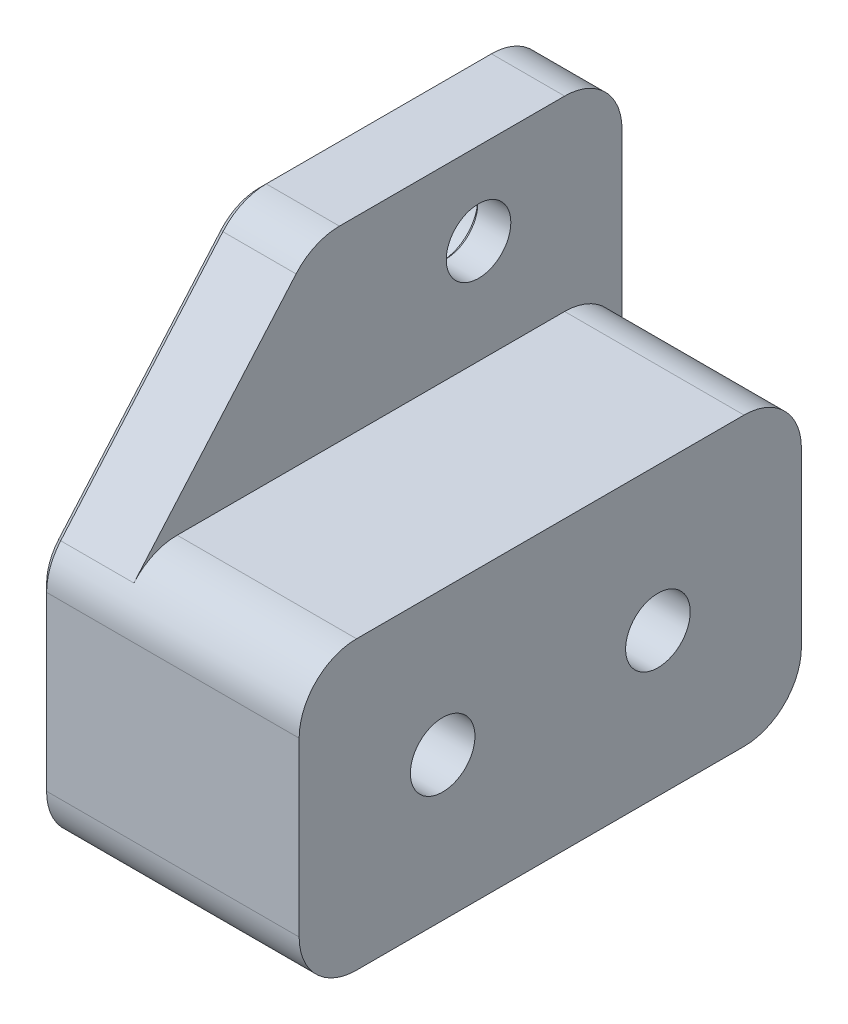
ISO-10303-21;
HEADER;
FILE_DESCRIPTION(('STEP AP214'),'2;1');
FILE_NAME('part.step','',(''),(''),'','','');
FILE_SCHEMA(('AUTOMOTIVE_DESIGN { 1 0 10303 214 1 1 1 1 }'));
ENDSEC;
DATA;
#1=APPLICATION_CONTEXT('core data for automotive mechanical design processes');
#2=APPLICATION_PROTOCOL_DEFINITION('international standard','automotive_design',2000,#1);
#3=PRODUCT_CONTEXT('',#1,'mechanical');
#4=PRODUCT('Part','Part','',(#3));
#5=PRODUCT_RELATED_PRODUCT_CATEGORY('part','',(#4));
#6=PRODUCT_DEFINITION_FORMATION('','',#4);
#7=PRODUCT_DEFINITION_CONTEXT('part definition',#1,'design');
#8=PRODUCT_DEFINITION('design','',#6,#7);
#9=PRODUCT_DEFINITION_SHAPE('','',#8);
#10=(LENGTH_UNIT() NAMED_UNIT(*) SI_UNIT(.MILLI.,.METRE.));
#11=(NAMED_UNIT(*) PLANE_ANGLE_UNIT() SI_UNIT($,.RADIAN.));
#12=(NAMED_UNIT(*) SI_UNIT($,.STERADIAN.) SOLID_ANGLE_UNIT());
#13=UNCERTAINTY_MEASURE_WITH_UNIT(LENGTH_MEASURE(1.E-05),#10,'distance_accuracy_value','');
#14=(GEOMETRIC_REPRESENTATION_CONTEXT(3) GLOBAL_UNCERTAINTY_ASSIGNED_CONTEXT((#13)) GLOBAL_UNIT_ASSIGNED_CONTEXT((#10,
#11,#12)) REPRESENTATION_CONTEXT('',''));
#15=CARTESIAN_POINT('',(0.,0.,0.));
#16=DIRECTION('',(0.,0.,1.));
#17=DIRECTION('',(1.,0.,0.));
#18=AXIS2_PLACEMENT_3D('',#15,#16,#17);
#19=CARTESIAN_POINT('',(0.,-6.,21.));
#20=DIRECTION('',(1.,0.,0.));
#21=DIRECTION('',(0.,0.,-1.));
#22=AXIS2_PLACEMENT_3D('',#19,#20,#21);
#23=PLANE('',#22);
#24=CARTESIAN_POINT('',(0.,17.25,0.));
#25=DIRECTION('',(1.,0.,0.));
#26=DIRECTION('',(0.,0.,-1.));
#27=AXIS2_PLACEMENT_3D('',#24,#25,#26);
#28=CIRCLE('',#27,3.45);
#29=CARTESIAN_POINT('',(0.,17.25,-3.45));
#30=VERTEX_POINT('',#29);
#31=EDGE_CURVE('E276',#30,#30,#28,.F.);
#32=ORIENTED_EDGE('',*,*,#31,.T.);
#33=EDGE_LOOP('',(#32));
#34=FACE_BOUND('',#33,.T.);
#35=CARTESIAN_POINT('',(0.,17.25,0.));
#36=DIRECTION('',(1.,0.,0.));
#37=DIRECTION('',(0.,0.,-1.));
#38=AXIS2_PLACEMENT_3D('',#35,#36,#37);
#39=CIRCLE('',#38,2.55);
#40=CARTESIAN_POINT('',(0.,17.25,-2.55));
#41=VERTEX_POINT('',#40);
#42=EDGE_CURVE('E273',#41,#41,#39,.T.);
#43=ORIENTED_EDGE('',*,*,#42,.T.);
#44=EDGE_LOOP('',(#43));
#45=FACE_BOUND('',#44,.T.);
#46=ADVANCED_FACE('F39',(#34,#45),#23,.F.);
#47=CARTESIAN_POINT('',(0.,0.,0.));
#48=DIRECTION('',(1.,0.,0.));
#49=DIRECTION('',(0.,0.,-1.));
#50=AXIS2_PLACEMENT_3D('',#47,#48,#49);
#51=CIRCLE('',#50,3.45);
#52=CARTESIAN_POINT('',(0.,0.,-3.45));
#53=VERTEX_POINT('',#52);
#54=EDGE_CURVE('E306',#53,#53,#51,.F.);
#55=ORIENTED_EDGE('',*,*,#54,.T.);
#56=EDGE_LOOP('',(#55));
#57=FACE_BOUND('',#56,.T.);
#58=CARTESIAN_POINT('',(0.,0.,0.));
#59=DIRECTION('',(1.,0.,0.));
#60=DIRECTION('',(0.,0.,-1.));
#61=AXIS2_PLACEMENT_3D('',#58,#59,#60);
#62=CIRCLE('',#61,2.55);
#63=CARTESIAN_POINT('',(0.,0.,-2.55));
#64=VERTEX_POINT('',#63);
#65=EDGE_CURVE('E302',#64,#64,#62,.T.);
#66=ORIENTED_EDGE('',*,*,#65,.T.);
#67=EDGE_LOOP('',(#66));
#68=FACE_BOUND('',#67,.T.);
#69=ADVANCED_FACE('F502',(#57,#68),#23,.F.);
#70=CARTESIAN_POINT('',(0.,0.,15.));
#71=DIRECTION('',(1.,0.,0.));
#72=DIRECTION('',(0.,0.,-1.));
#73=AXIS2_PLACEMENT_3D('',#70,#71,#72);
#74=CIRCLE('',#73,3.45);
#75=CARTESIAN_POINT('',(0.,0.,11.55));
#76=VERTEX_POINT('',#75);
#77=EDGE_CURVE('E290',#76,#76,#74,.F.);
#78=ORIENTED_EDGE('',*,*,#77,.T.);
#79=EDGE_LOOP('',(#78));
#80=FACE_BOUND('',#79,.T.);
#81=CARTESIAN_POINT('',(0.,0.,15.));
#82=DIRECTION('',(1.,0.,0.));
#83=DIRECTION('',(0.,0.,-1.));
#84=AXIS2_PLACEMENT_3D('',#81,#82,#83);
#85=CIRCLE('',#84,2.55);
#86=CARTESIAN_POINT('',(0.,0.,12.45));
#87=VERTEX_POINT('',#86);
#88=EDGE_CURVE('E286',#87,#87,#85,.T.);
#89=ORIENTED_EDGE('',*,*,#88,.T.);
#90=EDGE_LOOP('',(#89));
#91=FACE_BOUND('',#90,.T.);
#92=ADVANCED_FACE('F505',(#80,#91),#23,.F.);
#93=CARTESIAN_POINT('',(2.6,-6.,21.));
#94=DIRECTION('',(1.,0.,0.));
#95=DIRECTION('',(0.,0.,-1.));
#96=AXIS2_PLACEMENT_3D('',#93,#94,#95);
#97=PLANE('',#96);
#98=CARTESIAN_POINT('',(2.6,5.99999999999999,21.));
#99=DIRECTION('',(1.,0.,0.));
#100=DIRECTION('',(0.,0.,1.));
#101=AXIS2_PLACEMENT_3D('',#98,#99,#100);
#102=CIRCLE('',#101,4.);
#103=CARTESIAN_POINT('',(2.6,9.99999999999999,21.));
#104=VERTEX_POINT('',#103);
#105=CARTESIAN_POINT('',(2.6,8.62471485969914,24.018422088654));
#106=VERTEX_POINT('',#105);
#107=EDGE_CURVE('E57',#104,#106,#102,.T.);
#108=ORIENTED_EDGE('',*,*,#107,.F.);
#109=DIRECTION('',(0.,0.,1.));
#110=VECTOR('',#109,1.);
#111=CARTESIAN_POINT('',(2.6,9.99999999999999,21.));
#112=LINE('',#111,#110);
#113=CARTESIAN_POINT('',(2.6,9.99999999999999,-6.));
#114=VERTEX_POINT('',#113);
#115=EDGE_CURVE('E201',#114,#104,#112,.T.);
#116=ORIENTED_EDGE('',*,*,#115,.F.);
#117=CARTESIAN_POINT('',(2.6,6.,-6.));
#118=DIRECTION('',(1.,0.,0.));
#119=DIRECTION('',(0.,0.,-1.));
#120=AXIS2_PLACEMENT_3D('',#117,#118,#119);
#121=CIRCLE('',#120,3.99999999999999);
#122=CARTESIAN_POINT('',(2.6,6.,-10.));
#123=VERTEX_POINT('',#122);
#124=EDGE_CURVE('E63',#123,#114,#121,.T.);
#125=ORIENTED_EDGE('',*,*,#124,.F.);
#126=DIRECTION('',(0.,1.,0.));
#127=VECTOR('',#126,1.);
#128=CARTESIAN_POINT('',(2.6,-6.,-10.));
#129=LINE('',#128,#127);
#130=CARTESIAN_POINT('',(2.6,19.,-10.));
#131=VERTEX_POINT('',#130);
#132=EDGE_CURVE('E233',#123,#131,#129,.T.);
#133=ORIENTED_EDGE('',*,*,#132,.T.);
#134=CARTESIAN_POINT('',(2.6,19.,-6.));
#135=DIRECTION('',(1.,0.,0.));
#136=DIRECTION('',(0.,0.,-1.));
#137=AXIS2_PLACEMENT_3D('',#134,#135,#136);
#138=CIRCLE('',#137,4.);
#139=CARTESIAN_POINT('',(2.6,23.,-6.));
#140=VERTEX_POINT('',#139);
#141=EDGE_CURVE('E235',#131,#140,#138,.T.);
#142=ORIENTED_EDGE('',*,*,#141,.T.);
#143=DIRECTION('',(0.,0.,1.));
#144=VECTOR('',#143,1.);
#145=CARTESIAN_POINT('',(2.6,23.,-6.));
#146=LINE('',#145,#144);
#147=CARTESIAN_POINT('',(2.6,23.,9.69565217391305));
#148=VERTEX_POINT('',#147);
#149=EDGE_CURVE('E237',#140,#148,#146,.T.);
#150=ORIENTED_EDGE('',*,*,#149,.T.);
#151=CARTESIAN_POINT('',(2.6,19.,9.69565217391305));
#152=DIRECTION('',(1.,0.,0.));
#153=DIRECTION('',(0.,0.,-1.));
#154=AXIS2_PLACEMENT_3D('',#151,#152,#153);
#155=CIRCLE('',#154,4.);
#156=CARTESIAN_POINT('',(2.6,21.6247148596991,12.7140742625671));
#157=VERTEX_POINT('',#156);
#158=EDGE_CURVE('E239',#148,#157,#155,.T.);
#159=ORIENTED_EDGE('',*,*,#158,.T.);
#160=DIRECTION('',(0.,-0.754605522163505,0.656178714924786));
#161=VECTOR('',#160,1.);
#162=CARTESIAN_POINT('',(2.6,21.6247148596991,12.7140742625671));
#163=LINE('',#162,#161);
#164=EDGE_CURVE('E241',#157,#106,#163,.T.);
#165=ORIENTED_EDGE('',*,*,#164,.T.);
#166=EDGE_LOOP('',(#108,#116,#125,#133,#142,#150,#159,#165));
#167=FACE_BOUND('',#166,.T.);
#168=CARTESIAN_POINT('',(2.6,17.25,0.));
#169=DIRECTION('',(1.,0.,0.));
#170=DIRECTION('',(0.,0.,-1.));
#171=AXIS2_PLACEMENT_3D('',#168,#169,#170);
#172=CIRCLE('',#171,2.25);
#173=CARTESIAN_POINT('',(2.6,17.25,-2.25));
#174=VERTEX_POINT('',#173);
#175=EDGE_CURVE('E230',#174,#174,#172,.T.);
#176=ORIENTED_EDGE('',*,*,#175,.F.);
#177=EDGE_LOOP('',(#176));
#178=FACE_BOUND('',#177,.T.);
#179=ADVANCED_FACE('F478',(#167,#178),#97,.T.);
#180=CARTESIAN_POINT('',(2.6,-6.,21.));
#181=DIRECTION('',(-1.,0.,0.));
#182=DIRECTION('',(0.,0.,1.));
#183=AXIS2_PLACEMENT_3D('',#180,#181,#182);
#184=CYLINDRICAL_SURFACE('',#183,4.);
#185=DIRECTION('',(-1.,0.,0.));
#186=VECTOR('',#185,1.);
#187=CARTESIAN_POINT('',(2.6,-6.,25.));
#188=LINE('',#187,#186);
#189=CARTESIAN_POINT('',(15.1,-6.,25.));
#190=VERTEX_POINT('',#189);
#191=CARTESIAN_POINT('',(-2.5,-6.,25.));
#192=VERTEX_POINT('',#191);
#193=EDGE_CURVE('E243',#190,#192,#188,.T.);
#194=ORIENTED_EDGE('',*,*,#193,.T.);
#195=CARTESIAN_POINT('',(-2.5,-6.,21.));
#196=DIRECTION('',(1.,0.,0.));
#197=DIRECTION('',(0.,0.,-1.));
#198=AXIS2_PLACEMENT_3D('',#195,#196,#197);
#199=CIRCLE('',#198,4.);
#200=CARTESIAN_POINT('',(-2.5,-10.,21.));
#201=VERTEX_POINT('',#200);
#202=EDGE_CURVE('E371',#192,#201,#199,.T.);
#203=ORIENTED_EDGE('',*,*,#202,.T.);
#204=DIRECTION('',(-1.,0.,0.));
#205=VECTOR('',#204,1.);
#206=CARTESIAN_POINT('',(2.6,-10.,21.));
#207=LINE('',#206,#205);
#208=CARTESIAN_POINT('',(15.1,-10.,21.));
#209=VERTEX_POINT('',#208);
#210=EDGE_CURVE('E266',#209,#201,#207,.T.);
#211=ORIENTED_EDGE('',*,*,#210,.F.);
#212=CARTESIAN_POINT('',(15.1,-6.,21.));
#213=DIRECTION('',(1.,0.,0.));
#214=DIRECTION('',(0.,0.,-1.));
#215=AXIS2_PLACEMENT_3D('',#212,#213,#214);
#216=CIRCLE('',#215,4.);
#217=EDGE_CURVE('E216',#190,#209,#216,.T.);
#218=ORIENTED_EDGE('',*,*,#217,.F.);
#219=EDGE_LOOP('',(#194,#203,#211,#218));
#220=FACE_BOUND('',#219,.T.);
#221=ADVANCED_FACE('F441',(#220),#184,.T.);
#222=CARTESIAN_POINT('',(2.6,-10.,21.));
#223=DIRECTION('',(0.,1.,0.));
#224=DIRECTION('',(0.,0.,1.));
#225=AXIS2_PLACEMENT_3D('',#222,#223,#224);
#226=PLANE('',#225);
#227=ORIENTED_EDGE('',*,*,#210,.T.);
#228=DIRECTION('',(0.,0.,-1.));
#229=VECTOR('',#228,1.);
#230=CARTESIAN_POINT('',(-2.5,-10.,21.));
#231=LINE('',#230,#229);
#232=CARTESIAN_POINT('',(-2.5,-10.,-6.));
#233=VERTEX_POINT('',#232);
#234=EDGE_CURVE('E314',#201,#233,#231,.T.);
#235=ORIENTED_EDGE('',*,*,#234,.T.);
#236=DIRECTION('',(-1.,0.,0.));
#237=VECTOR('',#236,1.);
#238=CARTESIAN_POINT('',(2.6,-10.,-6.));
#239=LINE('',#238,#237);
#240=CARTESIAN_POINT('',(15.1,-10.,-6.));
#241=VERTEX_POINT('',#240);
#242=EDGE_CURVE('E182',#241,#233,#239,.T.);
#243=ORIENTED_EDGE('',*,*,#242,.F.);
#244=DIRECTION('',(0.,0.,-1.));
#245=VECTOR('',#244,1.);
#246=CARTESIAN_POINT('',(15.1,-10.,21.));
#247=LINE('',#246,#245);
#248=EDGE_CURVE('E199',#209,#241,#247,.T.);
#249=ORIENTED_EDGE('',*,*,#248,.F.);
#250=EDGE_LOOP('',(#227,#235,#243,#249));
#251=FACE_BOUND('',#250,.T.);
#252=ADVANCED_FACE('F443',(#251),#226,.F.);
#253=CARTESIAN_POINT('',(2.6,-6.,-6.));
#254=DIRECTION('',(-1.,0.,0.));
#255=DIRECTION('',(0.,0.,1.));
#256=AXIS2_PLACEMENT_3D('',#253,#254,#255);
#257=CYLINDRICAL_SURFACE('',#256,4.);
#258=ORIENTED_EDGE('',*,*,#242,.T.);
#259=CARTESIAN_POINT('',(-2.5,-6.,-6.));
#260=DIRECTION('',(1.,0.,0.));
#261=DIRECTION('',(0.,0.,-1.));
#262=AXIS2_PLACEMENT_3D('',#259,#260,#261);
#263=CIRCLE('',#262,4.);
#264=CARTESIAN_POINT('',(-2.5,-6.,-10.));
#265=VERTEX_POINT('',#264);
#266=EDGE_CURVE('E179',#233,#265,#263,.T.);
#267=ORIENTED_EDGE('',*,*,#266,.T.);
#268=DIRECTION('',(-1.,0.,0.));
#269=VECTOR('',#268,1.);
#270=CARTESIAN_POINT('',(2.6,-6.,-10.));
#271=LINE('',#270,#269);
#272=CARTESIAN_POINT('',(15.1,-6.,-10.));
#273=VERTEX_POINT('',#272);
#274=EDGE_CURVE('E172',#273,#265,#271,.T.);
#275=ORIENTED_EDGE('',*,*,#274,.F.);
#276=CARTESIAN_POINT('',(15.1,-6.,-6.));
#277=DIRECTION('',(1.,0.,0.));
#278=DIRECTION('',(0.,0.,-1.));
#279=AXIS2_PLACEMENT_3D('',#276,#277,#278);
#280=CIRCLE('',#279,4.);
#281=EDGE_CURVE('E177',#241,#273,#280,.T.);
#282=ORIENTED_EDGE('',*,*,#281,.F.);
#283=EDGE_LOOP('',(#258,#267,#275,#282));
#284=FACE_BOUND('',#283,.T.);
#285=ADVANCED_FACE('F175',(#284),#257,.T.);
#286=CARTESIAN_POINT('',(2.6,-6.,-10.));
#287=DIRECTION('',(0.,0.,1.));
#288=DIRECTION('',(0.,-1.,0.));
#289=AXIS2_PLACEMENT_3D('',#286,#287,#288);
#290=PLANE('',#289);
#291=ORIENTED_EDGE('',*,*,#274,.T.);
#292=DIRECTION('',(0.,1.,0.));
#293=VECTOR('',#292,1.);
#294=CARTESIAN_POINT('',(-2.5,-6.,-10.));
#295=LINE('',#294,#293);
#296=CARTESIAN_POINT('',(-2.5,19.,-10.));
#297=VERTEX_POINT('',#296);
#298=EDGE_CURVE('E356',#265,#297,#295,.T.);
#299=ORIENTED_EDGE('',*,*,#298,.T.);
#300=DIRECTION('',(-1.,0.,0.));
#301=VECTOR('',#300,1.);
#302=CARTESIAN_POINT('',(2.6,19.,-10.));
#303=LINE('',#302,#301);
#304=EDGE_CURVE('E183',#131,#297,#303,.T.);
#305=ORIENTED_EDGE('',*,*,#304,.F.);
#306=ORIENTED_EDGE('',*,*,#132,.F.);
#307=DIRECTION('',(-1.,0.,0.));
#308=VECTOR('',#307,1.);
#309=CARTESIAN_POINT('',(15.1,6.,-9.99999999999999));
#310=LINE('',#309,#308);
#311=CARTESIAN_POINT('',(15.1,6.,-9.99999999999999));
#312=VERTEX_POINT('',#311);
#313=EDGE_CURVE('E189',#312,#123,#310,.T.);
#314=ORIENTED_EDGE('',*,*,#313,.F.);
#315=DIRECTION('',(0.,1.,0.));
#316=VECTOR('',#315,1.);
#317=CARTESIAN_POINT('',(15.1,-6.,-10.));
#318=LINE('',#317,#316);
#319=EDGE_CURVE('E186',#273,#312,#318,.T.);
#320=ORIENTED_EDGE('',*,*,#319,.F.);
#321=EDGE_LOOP('',(#291,#299,#305,#306,#314,#320));
#322=FACE_BOUND('',#321,.T.);
#323=ADVANCED_FACE('F187',(#322),#290,.F.);
#324=CARTESIAN_POINT('',(2.6,19.,-6.));
#325=DIRECTION('',(-1.,0.,0.));
#326=DIRECTION('',(0.,0.,1.));
#327=AXIS2_PLACEMENT_3D('',#324,#325,#326);
#328=CYLINDRICAL_SURFACE('',#327,4.);
#329=ORIENTED_EDGE('',*,*,#304,.T.);
#330=CARTESIAN_POINT('',(-2.5,19.,-6.));
#331=DIRECTION('',(1.,0.,0.));
#332=DIRECTION('',(0.,0.,-1.));
#333=AXIS2_PLACEMENT_3D('',#330,#331,#332);
#334=CIRCLE('',#333,4.);
#335=CARTESIAN_POINT('',(-2.5,23.,-6.));
#336=VERTEX_POINT('',#335);
#337=EDGE_CURVE('E358',#297,#336,#334,.T.);
#338=ORIENTED_EDGE('',*,*,#337,.T.);
#339=DIRECTION('',(-1.,0.,0.));
#340=VECTOR('',#339,1.);
#341=CARTESIAN_POINT('',(2.6,23.,-6.));
#342=LINE('',#341,#340);
#343=EDGE_CURVE('E259',#140,#336,#342,.T.);
#344=ORIENTED_EDGE('',*,*,#343,.F.);
#345=ORIENTED_EDGE('',*,*,#141,.F.);
#346=EDGE_LOOP('',(#329,#338,#344,#345));
#347=FACE_BOUND('',#346,.T.);
#348=ADVANCED_FACE('F463',(#347),#328,.T.);
#349=CARTESIAN_POINT('',(2.6,23.,-6.));
#350=DIRECTION('',(0.,-1.,0.));
#351=DIRECTION('',(0.,0.,-1.));
#352=AXIS2_PLACEMENT_3D('',#349,#350,#351);
#353=PLANE('',#352);
#354=ORIENTED_EDGE('',*,*,#343,.T.);
#355=DIRECTION('',(0.,0.,1.));
#356=VECTOR('',#355,1.);
#357=CARTESIAN_POINT('',(-2.5,23.,-6.));
#358=LINE('',#357,#356);
#359=CARTESIAN_POINT('',(-2.5,23.,9.69565217391305));
#360=VERTEX_POINT('',#359);
#361=EDGE_CURVE('E360',#336,#360,#358,.T.);
#362=ORIENTED_EDGE('',*,*,#361,.T.);
#363=DIRECTION('',(-1.,0.,0.));
#364=VECTOR('',#363,1.);
#365=CARTESIAN_POINT('',(2.6,23.,9.69565217391305));
#366=LINE('',#365,#364);
#367=EDGE_CURVE('E256',#148,#360,#366,.T.);
#368=ORIENTED_EDGE('',*,*,#367,.F.);
#369=ORIENTED_EDGE('',*,*,#149,.F.);
#370=EDGE_LOOP('',(#354,#362,#368,#369));
#371=FACE_BOUND('',#370,.T.);
#372=ADVANCED_FACE('F471',(#371),#353,.F.);
#373=CARTESIAN_POINT('',(2.6,19.,9.69565217391305));
#374=DIRECTION('',(-1.,0.,0.));
#375=DIRECTION('',(0.,0.,1.));
#376=AXIS2_PLACEMENT_3D('',#373,#374,#375);
#377=CYLINDRICAL_SURFACE('',#376,4.);
#378=ORIENTED_EDGE('',*,*,#367,.T.);
#379=CARTESIAN_POINT('',(-2.5,19.,9.69565217391305));
#380=DIRECTION('',(1.,0.,0.));
#381=DIRECTION('',(0.,0.,-1.));
#382=AXIS2_PLACEMENT_3D('',#379,#380,#381);
#383=CIRCLE('',#382,4.);
#384=CARTESIAN_POINT('',(-2.5,21.6247148596991,12.7140742625671));
#385=VERTEX_POINT('',#384);
#386=EDGE_CURVE('E362',#360,#385,#383,.T.);
#387=ORIENTED_EDGE('',*,*,#386,.T.);
#388=DIRECTION('',(-1.,0.,0.));
#389=VECTOR('',#388,1.);
#390=CARTESIAN_POINT('',(2.6,21.6247148596991,12.7140742625671));
#391=LINE('',#390,#389);
#392=EDGE_CURVE('E253',#157,#385,#391,.T.);
#393=ORIENTED_EDGE('',*,*,#392,.F.);
#394=ORIENTED_EDGE('',*,*,#158,.F.);
#395=EDGE_LOOP('',(#378,#387,#393,#394));
#396=FACE_BOUND('',#395,.T.);
#397=ADVANCED_FACE('F475',(#396),#377,.T.);
#398=CARTESIAN_POINT('',(2.6,21.6247148596991,12.7140742625671));
#399=DIRECTION('',(0.,-0.656178714924786,-0.754605522163505));
#400=DIRECTION('',(0.,0.754605522163505,-0.656178714924786));
#401=AXIS2_PLACEMENT_3D('',#398,#399,#400);
#402=PLANE('',#401);
#403=ORIENTED_EDGE('',*,*,#392,.T.);
#404=DIRECTION('',(0.,-0.754605522163505,0.656178714924786));
#405=VECTOR('',#404,1.);
#406=CARTESIAN_POINT('',(-2.5,21.6247148596991,12.7140742625671));
#407=LINE('',#406,#405);
#408=CARTESIAN_POINT('',(-2.5,8.62471485969914,24.018422088654));
#409=VERTEX_POINT('',#408);
#410=EDGE_CURVE('E364',#385,#409,#407,.T.);
#411=ORIENTED_EDGE('',*,*,#410,.T.);
#412=DIRECTION('',(-1.,0.,0.));
#413=VECTOR('',#412,1.);
#414=CARTESIAN_POINT('',(2.6,8.62471485969914,24.018422088654));
#415=LINE('',#414,#413);
#416=EDGE_CURVE('E250',#106,#409,#415,.T.);
#417=ORIENTED_EDGE('',*,*,#416,.F.);
#418=ORIENTED_EDGE('',*,*,#164,.F.);
#419=EDGE_LOOP('',(#403,#411,#417,#418));
#420=FACE_BOUND('',#419,.T.);
#421=ADVANCED_FACE('F492',(#420),#402,.F.);
#422=CARTESIAN_POINT('',(2.6,5.99999999999999,21.));
#423=DIRECTION('',(-1.,0.,0.));
#424=DIRECTION('',(0.,0.,1.));
#425=AXIS2_PLACEMENT_3D('',#422,#423,#424);
#426=CYLINDRICAL_SURFACE('',#425,4.);
#427=ORIENTED_EDGE('',*,*,#416,.T.);
#428=CARTESIAN_POINT('',(-2.5,5.99999999999999,21.));
#429=DIRECTION('',(1.,0.,0.));
#430=DIRECTION('',(0.,0.,-1.));
#431=AXIS2_PLACEMENT_3D('',#428,#429,#430);
#432=CIRCLE('',#431,4.);
#433=CARTESIAN_POINT('',(-2.5,5.99999999999999,25.));
#434=VERTEX_POINT('',#433);
#435=EDGE_CURVE('E366',#409,#434,#432,.T.);
#436=ORIENTED_EDGE('',*,*,#435,.T.);
#437=DIRECTION('',(-1.,0.,0.));
#438=VECTOR('',#437,1.);
#439=CARTESIAN_POINT('',(2.6,5.99999999999999,25.));
#440=LINE('',#439,#438);
#441=CARTESIAN_POINT('',(15.1,5.99999999999999,25.));
#442=VERTEX_POINT('',#441);
#443=EDGE_CURVE('E247',#442,#434,#440,.T.);
#444=ORIENTED_EDGE('',*,*,#443,.F.);
#445=CARTESIAN_POINT('',(15.1,5.99999999999999,21.));
#446=DIRECTION('',(1.,0.,0.));
#447=DIRECTION('',(0.,0.,1.));
#448=AXIS2_PLACEMENT_3D('',#445,#446,#447);
#449=CIRCLE('',#448,4.);
#450=CARTESIAN_POINT('',(15.1,9.99999999999999,21.));
#451=VERTEX_POINT('',#450);
#452=EDGE_CURVE('E210',#451,#442,#449,.T.);
#453=ORIENTED_EDGE('',*,*,#452,.F.);
#454=DIRECTION('',(-1.,0.,0.));
#455=VECTOR('',#454,1.);
#456=CARTESIAN_POINT('',(15.1,9.99999999999999,21.));
#457=LINE('',#456,#455);
#458=EDGE_CURVE('E220',#451,#104,#457,.T.);
#459=ORIENTED_EDGE('',*,*,#458,.T.);
#460=ORIENTED_EDGE('',*,*,#107,.T.);
#461=EDGE_LOOP('',(#427,#436,#444,#453,#459,#460));
#462=FACE_BOUND('',#461,.T.);
#463=ADVANCED_FACE('F490',(#462),#426,.T.);
#464=CARTESIAN_POINT('',(2.6,5.99999999999999,25.));
#465=DIRECTION('',(0.,0.,-1.));
#466=DIRECTION('',(0.,1.,0.));
#467=AXIS2_PLACEMENT_3D('',#464,#465,#466);
#468=PLANE('',#467);
#469=ORIENTED_EDGE('',*,*,#443,.T.);
#470=DIRECTION('',(0.,-1.,0.));
#471=VECTOR('',#470,1.);
#472=CARTESIAN_POINT('',(-2.5,5.99999999999999,25.));
#473=LINE('',#472,#471);
#474=EDGE_CURVE('E368',#434,#192,#473,.T.);
#475=ORIENTED_EDGE('',*,*,#474,.T.);
#476=ORIENTED_EDGE('',*,*,#193,.F.);
#477=DIRECTION('',(0.,-1.,0.));
#478=VECTOR('',#477,1.);
#479=CARTESIAN_POINT('',(15.1,-6.,25.));
#480=LINE('',#479,#478);
#481=EDGE_CURVE('E213',#442,#190,#480,.T.);
#482=ORIENTED_EDGE('',*,*,#481,.F.);
#483=EDGE_LOOP('',(#469,#475,#476,#482));
#484=FACE_BOUND('',#483,.T.);
#485=ADVANCED_FACE('F437',(#484),#468,.F.);
#486=CARTESIAN_POINT('',(2.6,0.,15.));
#487=DIRECTION('',(-1.,0.,0.));
#488=DIRECTION('',(0.,0.,1.));
#489=AXIS2_PLACEMENT_3D('',#486,#487,#488);
#490=CYLINDRICAL_SURFACE('',#489,2.25);
#491=CARTESIAN_POINT('',(0.300000000000002,0.,15.));
#492=DIRECTION('',(1.,0.,0.));
#493=DIRECTION('',(0.,0.,-1.));
#494=AXIS2_PLACEMENT_3D('',#491,#492,#493);
#495=CIRCLE('',#494,2.25);
#496=CARTESIAN_POINT('',(0.300000000000002,0.,12.75));
#497=VERTEX_POINT('',#496);
#498=EDGE_CURVE('E294',#497,#497,#495,.F.);
#499=ORIENTED_EDGE('',*,*,#498,.T.);
#500=EDGE_LOOP('',(#499));
#501=FACE_BOUND('',#500,.T.);
#502=CARTESIAN_POINT('',(15.1,0.,15.));
#503=DIRECTION('',(1.,0.,0.));
#504=DIRECTION('',(0.,0.,-1.));
#505=AXIS2_PLACEMENT_3D('',#502,#503,#504);
#506=CIRCLE('',#505,2.25);
#507=CARTESIAN_POINT('',(15.1,0.,12.75));
#508=VERTEX_POINT('',#507);
#509=EDGE_CURVE('E657',#508,#508,#506,.T.);
#510=ORIENTED_EDGE('',*,*,#509,.T.);
#511=EDGE_LOOP('',(#510));
#512=FACE_BOUND('',#511,.T.);
#513=ADVANCED_FACE('F647',(#501,#512),#490,.F.);
#514=CARTESIAN_POINT('',(2.6,17.25,0.));
#515=DIRECTION('',(-1.,0.,0.));
#516=DIRECTION('',(0.,0.,1.));
#517=AXIS2_PLACEMENT_3D('',#514,#515,#516);
#518=CYLINDRICAL_SURFACE('',#517,2.25);
#519=CARTESIAN_POINT('',(0.300000000000005,17.25,0.));
#520=DIRECTION('',(1.,0.,0.));
#521=DIRECTION('',(0.,0.,-1.));
#522=AXIS2_PLACEMENT_3D('',#519,#520,#521);
#523=CIRCLE('',#522,2.25);
#524=CARTESIAN_POINT('',(0.300000000000005,17.25,-2.25));
#525=VERTEX_POINT('',#524);
#526=EDGE_CURVE('E279',#525,#525,#523,.F.);
#527=ORIENTED_EDGE('',*,*,#526,.T.);
#528=EDGE_LOOP('',(#527));
#529=FACE_BOUND('',#528,.T.);
#530=ORIENTED_EDGE('',*,*,#175,.T.);
#531=EDGE_LOOP('',(#530));
#532=FACE_BOUND('',#531,.T.);
#533=ADVANCED_FACE('F640',(#529,#532),#518,.F.);
#534=CARTESIAN_POINT('',(2.6,0.,0.));
#535=DIRECTION('',(-1.,0.,0.));
#536=DIRECTION('',(0.,0.,1.));
#537=AXIS2_PLACEMENT_3D('',#534,#535,#536);
#538=CYLINDRICAL_SURFACE('',#537,2.25);
#539=CARTESIAN_POINT('',(0.300000000000006,0.,0.));
#540=DIRECTION('',(1.,0.,0.));
#541=DIRECTION('',(0.,0.,-1.));
#542=AXIS2_PLACEMENT_3D('',#539,#540,#541);
#543=CIRCLE('',#542,2.25);
#544=CARTESIAN_POINT('',(0.300000000000006,0.,-2.25));
#545=VERTEX_POINT('',#544);
#546=EDGE_CURVE('E310',#545,#545,#543,.F.);
#547=ORIENTED_EDGE('',*,*,#546,.T.);
#548=EDGE_LOOP('',(#547));
#549=FACE_BOUND('',#548,.T.);
#550=CARTESIAN_POINT('',(15.1,0.,0.));
#551=DIRECTION('',(1.,0.,0.));
#552=DIRECTION('',(0.,0.,-1.));
#553=AXIS2_PLACEMENT_3D('',#550,#551,#552);
#554=CIRCLE('',#553,2.25);
#555=CARTESIAN_POINT('',(15.1,0.,-2.25));
#556=VERTEX_POINT('',#555);
#557=EDGE_CURVE('E204',#556,#556,#554,.T.);
#558=ORIENTED_EDGE('',*,*,#557,.T.);
#559=EDGE_LOOP('',(#558));
#560=FACE_BOUND('',#559,.T.);
#561=ADVANCED_FACE('F629',(#549,#560),#538,.F.);
#562=CARTESIAN_POINT('',(-3.,-6.,21.));
#563=DIRECTION('',(1.,0.,0.));
#564=DIRECTION('',(0.,0.,-1.));
#565=AXIS2_PLACEMENT_3D('',#562,#563,#564);
#566=PLANE('',#565);
#567=CARTESIAN_POINT('',(-3.,-6.,-6.));
#568=DIRECTION('',(1.,0.,0.));
#569=DIRECTION('',(0.,0.,-1.));
#570=AXIS2_PLACEMENT_3D('',#567,#568,#569);
#571=CIRCLE('',#570,3.5);
#572=CARTESIAN_POINT('',(-3.,-6.,-9.5));
#573=VERTEX_POINT('',#572);
#574=CARTESIAN_POINT('',(-3.,-9.5,-6.));
#575=VERTEX_POINT('',#574);
#576=EDGE_CURVE('E347',#573,#575,#571,.F.);
#577=ORIENTED_EDGE('',*,*,#576,.T.);
#578=DIRECTION('',(0.,0.,1.));
#579=VECTOR('',#578,1.);
#580=CARTESIAN_POINT('',(-3.,-9.5,21.));
#581=LINE('',#580,#579);
#582=CARTESIAN_POINT('',(-3.,-9.5,21.));
#583=VERTEX_POINT('',#582);
#584=EDGE_CURVE('E350',#575,#583,#581,.T.);
#585=ORIENTED_EDGE('',*,*,#584,.T.);
#586=CARTESIAN_POINT('',(-3.,-6.,21.));
#587=DIRECTION('',(1.,0.,0.));
#588=DIRECTION('',(0.,0.,-1.));
#589=AXIS2_PLACEMENT_3D('',#586,#587,#588);
#590=CIRCLE('',#589,3.5);
#591=CARTESIAN_POINT('',(-3.,-6.,24.5));
#592=VERTEX_POINT('',#591);
#593=EDGE_CURVE('E329',#583,#592,#590,.F.);
#594=ORIENTED_EDGE('',*,*,#593,.T.);
#595=DIRECTION('',(0.,1.,0.));
#596=VECTOR('',#595,1.);
#597=CARTESIAN_POINT('',(-3.,-6.,24.5));
#598=LINE('',#597,#596);
#599=CARTESIAN_POINT('',(-3.,5.99999999999999,24.5));
#600=VERTEX_POINT('',#599);
#601=EDGE_CURVE('E332',#592,#600,#598,.T.);
#602=ORIENTED_EDGE('',*,*,#601,.T.);
#603=CARTESIAN_POINT('',(-3.,5.99999999999999,21.));
#604=DIRECTION('',(1.,0.,0.));
#605=DIRECTION('',(0.,0.,-1.));
#606=AXIS2_PLACEMENT_3D('',#603,#604,#605);
#607=CIRCLE('',#606,3.5);
#608=CARTESIAN_POINT('',(-3.,8.29662550223675,23.6411193275723));
#609=VERTEX_POINT('',#608);
#610=EDGE_CURVE('E335',#600,#609,#607,.F.);
#611=ORIENTED_EDGE('',*,*,#610,.T.);
#612=DIRECTION('',(0.,0.754605522163505,-0.656178714924787));
#613=VECTOR('',#612,1.);
#614=CARTESIAN_POINT('',(-3.,1.46347157328088,29.582992309273));
#615=LINE('',#614,#613);
#616=CARTESIAN_POINT('',(-3.,21.2966255022367,12.3367715014853));
#617=VERTEX_POINT('',#616);
#618=EDGE_CURVE('E337',#609,#617,#615,.T.);
#619=ORIENTED_EDGE('',*,*,#618,.T.);
#620=CARTESIAN_POINT('',(-3.,19.,9.69565217391305));
#621=DIRECTION('',(1.,0.,0.));
#622=DIRECTION('',(0.,0.,-1.));
#623=AXIS2_PLACEMENT_3D('',#620,#621,#622);
#624=CIRCLE('',#623,3.5);
#625=CARTESIAN_POINT('',(-3.,22.5,9.69565217391305));
#626=VERTEX_POINT('',#625);
#627=EDGE_CURVE('E339',#617,#626,#624,.F.);
#628=ORIENTED_EDGE('',*,*,#627,.T.);
#629=DIRECTION('',(0.,0.,-1.));
#630=VECTOR('',#629,1.);
#631=CARTESIAN_POINT('',(-3.,22.5,21.));
#632=LINE('',#631,#630);
#633=CARTESIAN_POINT('',(-3.,22.5,-6.));
#634=VERTEX_POINT('',#633);
#635=EDGE_CURVE('E341',#626,#634,#632,.T.);
#636=ORIENTED_EDGE('',*,*,#635,.T.);
#637=CARTESIAN_POINT('',(-3.,19.,-6.));
#638=DIRECTION('',(1.,0.,0.));
#639=DIRECTION('',(0.,0.,-1.));
#640=AXIS2_PLACEMENT_3D('',#637,#638,#639);
#641=CIRCLE('',#640,3.5);
#642=CARTESIAN_POINT('',(-3.,19.,-9.5));
#643=VERTEX_POINT('',#642);
#644=EDGE_CURVE('E343',#634,#643,#641,.F.);
#645=ORIENTED_EDGE('',*,*,#644,.T.);
#646=DIRECTION('',(0.,-1.,0.));
#647=VECTOR('',#646,1.);
#648=CARTESIAN_POINT('',(-3.,-6.,-9.5));
#649=LINE('',#648,#647);
#650=EDGE_CURVE('E345',#643,#573,#649,.T.);
#651=ORIENTED_EDGE('',*,*,#650,.T.);
#652=EDGE_LOOP('',(#577,#585,#594,#602,#611,#619,#628,#636,#645,#651));
#653=FACE_BOUND('',#652,.T.);
#654=CARTESIAN_POINT('',(-3.,0.,15.));
#655=DIRECTION('',(1.,0.,0.));
#656=DIRECTION('',(0.,0.,-1.));
#657=AXIS2_PLACEMENT_3D('',#654,#655,#656);
#658=CIRCLE('',#657,4.25);
#659=CARTESIAN_POINT('',(-3.,0.,10.75));
#660=VERTEX_POINT('',#659);
#661=EDGE_CURVE('E325',#660,#660,#658,.T.);
#662=ORIENTED_EDGE('',*,*,#661,.T.);
#663=EDGE_LOOP('',(#662));
#664=FACE_BOUND('',#663,.T.);
#665=CARTESIAN_POINT('',(-3.,0.,0.));
#666=DIRECTION('',(1.,0.,0.));
#667=DIRECTION('',(0.,0.,-1.));
#668=AXIS2_PLACEMENT_3D('',#665,#666,#667);
#669=CIRCLE('',#668,4.25);
#670=CARTESIAN_POINT('',(-3.,0.,-4.25));
#671=VERTEX_POINT('',#670);
#672=EDGE_CURVE('E321',#671,#671,#669,.T.);
#673=ORIENTED_EDGE('',*,*,#672,.T.);
#674=EDGE_LOOP('',(#673));
#675=FACE_BOUND('',#674,.T.);
#676=CARTESIAN_POINT('',(-3.,17.25,0.));
#677=DIRECTION('',(1.,0.,0.));
#678=DIRECTION('',(0.,0.,-1.));
#679=AXIS2_PLACEMENT_3D('',#676,#677,#678);
#680=CIRCLE('',#679,4.25);
#681=CARTESIAN_POINT('',(-3.,17.25,-4.25));
#682=VERTEX_POINT('',#681);
#683=EDGE_CURVE('E318',#682,#682,#680,.T.);
#684=ORIENTED_EDGE('',*,*,#683,.T.);
#685=EDGE_LOOP('',(#684));
#686=FACE_BOUND('',#685,.T.);
#687=ADVANCED_FACE('F422',(#653,#664,#675,#686),#566,.F.);
#688=CARTESIAN_POINT('',(-3.,0.,15.));
#689=DIRECTION('',(1.,0.,0.));
#690=DIRECTION('',(0.,0.,-1.));
#691=AXIS2_PLACEMENT_3D('',#688,#689,#690);
#692=CYLINDRICAL_SURFACE('',#691,3.75);
#693=CARTESIAN_POINT('',(-2.5,0.,15.));
#694=DIRECTION('',(1.,0.,0.));
#695=DIRECTION('',(0.,0.,-1.));
#696=AXIS2_PLACEMENT_3D('',#693,#694,#695);
#697=CIRCLE('',#696,3.75);
#698=CARTESIAN_POINT('',(-2.5,0.,11.25));
#699=VERTEX_POINT('',#698);
#700=EDGE_CURVE('E374',#699,#699,#697,.F.);
#701=ORIENTED_EDGE('',*,*,#700,.T.);
#702=EDGE_LOOP('',(#701));
#703=FACE_BOUND('',#702,.T.);
#704=CARTESIAN_POINT('',(-0.300000000000003,0.,15.));
#705=DIRECTION('',(1.,0.,0.));
#706=DIRECTION('',(0.,0.,-1.));
#707=AXIS2_PLACEMENT_3D('',#704,#705,#706);
#708=CIRCLE('',#707,3.75);
#709=CARTESIAN_POINT('',(-0.300000000000003,0.,11.25));
#710=VERTEX_POINT('',#709);
#711=EDGE_CURVE('E282',#710,#710,#708,.T.);
#712=ORIENTED_EDGE('',*,*,#711,.T.);
#713=EDGE_LOOP('',(#712));
#714=FACE_BOUND('',#713,.T.);
#715=ADVANCED_FACE('F628',(#703,#714),#692,.F.);
#716=CARTESIAN_POINT('',(-3.,0.,0.));
#717=DIRECTION('',(1.,0.,0.));
#718=DIRECTION('',(0.,0.,-1.));
#719=AXIS2_PLACEMENT_3D('',#716,#717,#718);
#720=CYLINDRICAL_SURFACE('',#719,3.75);
#721=CARTESIAN_POINT('',(-2.5,0.,0.));
#722=DIRECTION('',(1.,0.,0.));
#723=DIRECTION('',(0.,0.,-1.));
#724=AXIS2_PLACEMENT_3D('',#721,#722,#723);
#725=CIRCLE('',#724,3.75);
#726=CARTESIAN_POINT('',(-2.5,0.,-3.75));
#727=VERTEX_POINT('',#726);
#728=EDGE_CURVE('E49',#727,#727,#725,.F.);
#729=ORIENTED_EDGE('',*,*,#728,.T.);
#730=EDGE_LOOP('',(#729));
#731=FACE_BOUND('',#730,.T.);
#732=CARTESIAN_POINT('',(-0.300000000000003,0.,0.));
#733=DIRECTION('',(1.,0.,0.));
#734=DIRECTION('',(0.,0.,-1.));
#735=AXIS2_PLACEMENT_3D('',#732,#733,#734);
#736=CIRCLE('',#735,3.75);
#737=CARTESIAN_POINT('',(-0.300000000000003,0.,-3.75));
#738=VERTEX_POINT('',#737);
#739=EDGE_CURVE('E298',#738,#738,#736,.T.);
#740=ORIENTED_EDGE('',*,*,#739,.T.);
#741=EDGE_LOOP('',(#740));
#742=FACE_BOUND('',#741,.T.);
#743=ADVANCED_FACE('F637',(#731,#742),#720,.F.);
#744=CARTESIAN_POINT('',(-3.,17.25,0.));
#745=DIRECTION('',(1.,0.,0.));
#746=DIRECTION('',(0.,0.,-1.));
#747=AXIS2_PLACEMENT_3D('',#744,#745,#746);
#748=CYLINDRICAL_SURFACE('',#747,3.75);
#749=CARTESIAN_POINT('',(-2.5,17.25,0.));
#750=DIRECTION('',(1.,0.,0.));
#751=DIRECTION('',(0.,0.,-1.));
#752=AXIS2_PLACEMENT_3D('',#749,#750,#751);
#753=CIRCLE('',#752,3.75);
#754=CARTESIAN_POINT('',(-2.5,17.25,-3.75));
#755=VERTEX_POINT('',#754);
#756=EDGE_CURVE('E11',#755,#755,#753,.F.);
#757=ORIENTED_EDGE('',*,*,#756,.T.);
#758=EDGE_LOOP('',(#757));
#759=FACE_BOUND('',#758,.T.);
#760=CARTESIAN_POINT('',(-0.300000000000003,17.25,0.));
#761=DIRECTION('',(1.,0.,0.));
#762=DIRECTION('',(0.,0.,-1.));
#763=AXIS2_PLACEMENT_3D('',#760,#761,#762);
#764=CIRCLE('',#763,3.75);
#765=CARTESIAN_POINT('',(-0.300000000000003,17.25,-3.75));
#766=VERTEX_POINT('',#765);
#767=EDGE_CURVE('E270',#766,#766,#764,.T.);
#768=ORIENTED_EDGE('',*,*,#767,.T.);
#769=EDGE_LOOP('',(#768));
#770=FACE_BOUND('',#769,.T.);
#771=ADVANCED_FACE('F671',(#759,#770),#748,.F.);
#772=CARTESIAN_POINT('',(-0.300000000000003,17.25,0.));
#773=DIRECTION('',(-1.,0.,0.));
#774=DIRECTION('',(0.,0.,1.));
#775=AXIS2_PLACEMENT_3D('',#772,#773,#774);
#776=CONICAL_SURFACE('',#775,3.75,0.785398163397441);
#777=ORIENTED_EDGE('',*,*,#31,.F.);
#778=EDGE_LOOP('',(#777));
#779=FACE_BOUND('',#778,.T.);
#780=ORIENTED_EDGE('',*,*,#767,.F.);
#781=EDGE_LOOP('',(#780));
#782=FACE_BOUND('',#781,.T.);
#783=ADVANCED_FACE('F673',(#779,#782),#776,.F.);
#784=CARTESIAN_POINT('',(0.,17.25,0.));
#785=DIRECTION('',(-1.,0.,0.));
#786=DIRECTION('',(0.,0.,1.));
#787=AXIS2_PLACEMENT_3D('',#784,#785,#786);
#788=CONICAL_SURFACE('',#787,2.55,0.785398163397445);
#789=ORIENTED_EDGE('',*,*,#526,.F.);
#790=EDGE_LOOP('',(#789));
#791=FACE_BOUND('',#790,.T.);
#792=ORIENTED_EDGE('',*,*,#42,.F.);
#793=EDGE_LOOP('',(#792));
#794=FACE_BOUND('',#793,.T.);
#795=ADVANCED_FACE('F535',(#791,#794),#788,.F.);
#796=CARTESIAN_POINT('',(-0.300000000000003,0.,15.));
#797=DIRECTION('',(-1.,0.,0.));
#798=DIRECTION('',(0.,0.,1.));
#799=AXIS2_PLACEMENT_3D('',#796,#797,#798);
#800=CONICAL_SURFACE('',#799,3.75,0.785398163397441);
#801=ORIENTED_EDGE('',*,*,#77,.F.);
#802=EDGE_LOOP('',(#801));
#803=FACE_BOUND('',#802,.T.);
#804=ORIENTED_EDGE('',*,*,#711,.F.);
#805=EDGE_LOOP('',(#804));
#806=FACE_BOUND('',#805,.T.);
#807=ADVANCED_FACE('F525',(#803,#806),#800,.F.);
#808=CARTESIAN_POINT('',(0.,0.,15.));
#809=DIRECTION('',(-1.,0.,0.));
#810=DIRECTION('',(0.,0.,1.));
#811=AXIS2_PLACEMENT_3D('',#808,#809,#810);
#812=CONICAL_SURFACE('',#811,2.55,0.785398163397447);
#813=ORIENTED_EDGE('',*,*,#498,.F.);
#814=EDGE_LOOP('',(#813));
#815=FACE_BOUND('',#814,.T.);
#816=ORIENTED_EDGE('',*,*,#88,.F.);
#817=EDGE_LOOP('',(#816));
#818=FACE_BOUND('',#817,.T.);
#819=ADVANCED_FACE('F522',(#815,#818),#812,.F.);
#820=CARTESIAN_POINT('',(-0.300000000000003,0.,0.));
#821=DIRECTION('',(-1.,0.,0.));
#822=DIRECTION('',(0.,0.,1.));
#823=AXIS2_PLACEMENT_3D('',#820,#821,#822);
#824=CONICAL_SURFACE('',#823,3.75,0.785398163397441);
#825=ORIENTED_EDGE('',*,*,#54,.F.);
#826=EDGE_LOOP('',(#825));
#827=FACE_BOUND('',#826,.T.);
#828=ORIENTED_EDGE('',*,*,#739,.F.);
#829=EDGE_LOOP('',(#828));
#830=FACE_BOUND('',#829,.T.);
#831=ADVANCED_FACE('F524',(#827,#830),#824,.F.);
#832=CARTESIAN_POINT('',(0.,0.,0.));
#833=DIRECTION('',(-1.,0.,0.));
#834=DIRECTION('',(0.,0.,1.));
#835=AXIS2_PLACEMENT_3D('',#832,#833,#834);
#836=CONICAL_SURFACE('',#835,2.55,0.785398163397445);
#837=ORIENTED_EDGE('',*,*,#546,.F.);
#838=EDGE_LOOP('',(#837));
#839=FACE_BOUND('',#838,.T.);
#840=ORIENTED_EDGE('',*,*,#65,.F.);
#841=EDGE_LOOP('',(#840));
#842=FACE_BOUND('',#841,.T.);
#843=ADVANCED_FACE('F532',(#839,#842),#836,.F.);
#844=CARTESIAN_POINT('',(-2.5,19.,9.69565217391305));
#845=DIRECTION('',(1.,0.,0.));
#846=DIRECTION('',(0.,0.,-1.));
#847=AXIS2_PLACEMENT_3D('',#844,#845,#846);
#848=CONICAL_SURFACE('',#847,4.,0.785398163397447);
#849=DIRECTION('',(0.707106781186547,0.707106781186548,0.));
#850=VECTOR('',#849,1.);
#851=CARTESIAN_POINT('',(-3.,22.5,9.69565217391305));
#852=LINE('',#851,#850);
#853=EDGE_CURVE('E404',#626,#360,#852,.T.);
#854=ORIENTED_EDGE('',*,*,#853,.F.);
#855=ORIENTED_EDGE('',*,*,#627,.F.);
#856=DIRECTION('',(-0.707106781186548,-0.463988418993592,-0.533586681842629));
#857=VECTOR('',#856,1.);
#858=CARTESIAN_POINT('',(-2.5,21.6247148596991,12.7140742625671));
#859=LINE('',#858,#857);
#860=EDGE_CURVE('E44',#385,#617,#859,.T.);
#861=ORIENTED_EDGE('',*,*,#860,.F.);
#862=ORIENTED_EDGE('',*,*,#386,.F.);
#863=EDGE_LOOP('',(#854,#855,#861,#862));
#864=FACE_BOUND('',#863,.T.);
#865=ADVANCED_FACE('F420',(#864),#848,.T.);
#866=CARTESIAN_POINT('',(-2.5,21.6247148596991,12.7140742625671));
#867=DIRECTION('',(0.707106781186546,-0.463988418993592,-0.533586681842631));
#868=DIRECTION('',(0.,-0.754605522163505,0.656178714924786));
#869=AXIS2_PLACEMENT_3D('',#866,#867,#868);
#870=PLANE('',#869);
#871=ORIENTED_EDGE('',*,*,#860,.T.);
#872=ORIENTED_EDGE('',*,*,#618,.F.);
#873=DIRECTION('',(-0.707106781186552,-0.463988418993588,-0.533586681842627));
#874=VECTOR('',#873,1.);
#875=CARTESIAN_POINT('',(-2.5,8.62471485969914,24.018422088654));
#876=LINE('',#875,#874);
#877=EDGE_CURVE('E402',#409,#609,#876,.T.);
#878=ORIENTED_EDGE('',*,*,#877,.F.);
#879=ORIENTED_EDGE('',*,*,#410,.F.);
#880=EDGE_LOOP('',(#871,#872,#878,#879));
#881=FACE_BOUND('',#880,.T.);
#882=ADVANCED_FACE('F415',(#881),#870,.F.);
#883=CARTESIAN_POINT('',(-2.5,23.,-6.));
#884=DIRECTION('',(0.707106781186548,-0.707106781186547,0.));
#885=DIRECTION('',(0.,0.,1.));
#886=AXIS2_PLACEMENT_3D('',#883,#884,#885);
#887=PLANE('',#886);
#888=ORIENTED_EDGE('',*,*,#853,.T.);
#889=ORIENTED_EDGE('',*,*,#361,.F.);
#890=DIRECTION('',(0.707106781186547,0.707106781186548,0.));
#891=VECTOR('',#890,1.);
#892=CARTESIAN_POINT('',(-3.,22.5,-6.));
#893=LINE('',#892,#891);
#894=EDGE_CURVE('E399',#634,#336,#893,.T.);
#895=ORIENTED_EDGE('',*,*,#894,.F.);
#896=ORIENTED_EDGE('',*,*,#635,.F.);
#897=EDGE_LOOP('',(#888,#889,#895,#896));
#898=FACE_BOUND('',#897,.T.);
#899=ADVANCED_FACE('F468',(#898),#887,.F.);
#900=CARTESIAN_POINT('',(-2.5,5.99999999999999,21.));
#901=DIRECTION('',(1.,0.,0.));
#902=DIRECTION('',(0.,0.,-1.));
#903=AXIS2_PLACEMENT_3D('',#900,#901,#902);
#904=CONICAL_SURFACE('',#903,4.,0.785398163397448);
#905=ORIENTED_EDGE('',*,*,#877,.T.);
#906=ORIENTED_EDGE('',*,*,#610,.F.);
#907=DIRECTION('',(-0.707106781186549,0.,-0.707106781186546));
#908=VECTOR('',#907,1.);
#909=CARTESIAN_POINT('',(-2.5,5.99999999999999,25.));
#910=LINE('',#909,#908);
#911=EDGE_CURVE('E396',#434,#600,#910,.T.);
#912=ORIENTED_EDGE('',*,*,#911,.F.);
#913=ORIENTED_EDGE('',*,*,#435,.F.);
#914=EDGE_LOOP('',(#905,#906,#912,#913));
#915=FACE_BOUND('',#914,.T.);
#916=ADVANCED_FACE('F429',(#915),#904,.T.);
#917=CARTESIAN_POINT('',(-2.5,19.,-6.));
#918=DIRECTION('',(1.,0.,0.));
#919=DIRECTION('',(0.,0.,-1.));
#920=AXIS2_PLACEMENT_3D('',#917,#918,#919);
#921=CONICAL_SURFACE('',#920,4.,0.785398163397448);
#922=ORIENTED_EDGE('',*,*,#894,.T.);
#923=ORIENTED_EDGE('',*,*,#337,.F.);
#924=DIRECTION('',(0.707106781186548,0.,-0.707106781186547));
#925=VECTOR('',#924,1.);
#926=CARTESIAN_POINT('',(-3.,19.,-9.5));
#927=LINE('',#926,#925);
#928=EDGE_CURVE('E393',#643,#297,#927,.T.);
#929=ORIENTED_EDGE('',*,*,#928,.F.);
#930=ORIENTED_EDGE('',*,*,#644,.F.);
#931=EDGE_LOOP('',(#922,#923,#929,#930));
#932=FACE_BOUND('',#931,.T.);
#933=ADVANCED_FACE('F466',(#932),#921,.T.);
#934=CARTESIAN_POINT('',(-2.5,5.99999999999999,25.));
#935=DIRECTION('',(0.707106781186548,0.,-0.707106781186547));
#936=DIRECTION('',(0.,-1.,0.));
#937=AXIS2_PLACEMENT_3D('',#934,#935,#936);
#938=PLANE('',#937);
#939=ORIENTED_EDGE('',*,*,#911,.T.);
#940=ORIENTED_EDGE('',*,*,#601,.F.);
#941=DIRECTION('',(-0.707106781186547,0.,-0.707106781186548));
#942=VECTOR('',#941,1.);
#943=CARTESIAN_POINT('',(-2.5,-6.,25.));
#944=LINE('',#943,#942);
#945=EDGE_CURVE('E389',#192,#592,#944,.T.);
#946=ORIENTED_EDGE('',*,*,#945,.F.);
#947=ORIENTED_EDGE('',*,*,#474,.F.);
#948=EDGE_LOOP('',(#939,#940,#946,#947));
#949=FACE_BOUND('',#948,.T.);
#950=ADVANCED_FACE('F433',(#949),#938,.F.);
#951=CARTESIAN_POINT('',(-2.5,-6.,-10.));
#952=DIRECTION('',(0.707106781186548,0.,0.707106781186547));
#953=DIRECTION('',(0.,1.,0.));
#954=AXIS2_PLACEMENT_3D('',#951,#952,#953);
#955=PLANE('',#954);
#956=ORIENTED_EDGE('',*,*,#928,.T.);
#957=ORIENTED_EDGE('',*,*,#298,.F.);
#958=DIRECTION('',(0.707106781186547,0.,-0.707106781186548));
#959=VECTOR('',#958,1.);
#960=CARTESIAN_POINT('',(-3.,-6.,-9.5));
#961=LINE('',#960,#959);
#962=EDGE_CURVE('E386',#573,#265,#961,.T.);
#963=ORIENTED_EDGE('',*,*,#962,.F.);
#964=ORIENTED_EDGE('',*,*,#650,.F.);
#965=EDGE_LOOP('',(#956,#957,#963,#964));
#966=FACE_BOUND('',#965,.T.);
#967=ADVANCED_FACE('F457',(#966),#955,.F.);
#968=CARTESIAN_POINT('',(-2.5,-6.,21.));
#969=DIRECTION('',(1.,0.,0.));
#970=DIRECTION('',(0.,0.,-1.));
#971=AXIS2_PLACEMENT_3D('',#968,#969,#970);
#972=CONICAL_SURFACE('',#971,4.,0.785398163397448);
#973=ORIENTED_EDGE('',*,*,#945,.T.);
#974=ORIENTED_EDGE('',*,*,#593,.F.);
#975=DIRECTION('',(-0.707106781186548,0.707106781186547,0.));
#976=VECTOR('',#975,1.);
#977=CARTESIAN_POINT('',(-2.5,-10.,21.));
#978=LINE('',#977,#976);
#979=EDGE_CURVE('E383',#201,#583,#978,.T.);
#980=ORIENTED_EDGE('',*,*,#979,.F.);
#981=ORIENTED_EDGE('',*,*,#202,.F.);
#982=EDGE_LOOP('',(#973,#974,#980,#981));
#983=FACE_BOUND('',#982,.T.);
#984=ADVANCED_FACE('F568',(#983),#972,.T.);
#985=CARTESIAN_POINT('',(-2.5,-6.,-6.));
#986=DIRECTION('',(1.,0.,0.));
#987=DIRECTION('',(0.,0.,-1.));
#988=AXIS2_PLACEMENT_3D('',#985,#986,#987);
#989=CONICAL_SURFACE('',#988,4.,0.785398163397448);
#990=ORIENTED_EDGE('',*,*,#962,.T.);
#991=ORIENTED_EDGE('',*,*,#266,.F.);
#992=DIRECTION('',(0.707106781186548,-0.707106781186547,0.));
#993=VECTOR('',#992,1.);
#994=CARTESIAN_POINT('',(-3.,-9.5,-6.));
#995=LINE('',#994,#993);
#996=EDGE_CURVE('E229',#575,#233,#995,.T.);
#997=ORIENTED_EDGE('',*,*,#996,.F.);
#998=ORIENTED_EDGE('',*,*,#576,.F.);
#999=EDGE_LOOP('',(#990,#991,#997,#998));
#1000=FACE_BOUND('',#999,.T.);
#1001=ADVANCED_FACE('F453',(#1000),#989,.T.);
#1002=CARTESIAN_POINT('',(-2.5,-10.,21.));
#1003=DIRECTION('',(0.707106781186547,0.707106781186548,0.));
#1004=DIRECTION('',(0.,0.,-1.));
#1005=AXIS2_PLACEMENT_3D('',#1002,#1003,#1004);
#1006=PLANE('',#1005);
#1007=ORIENTED_EDGE('',*,*,#979,.T.);
#1008=ORIENTED_EDGE('',*,*,#584,.F.);
#1009=ORIENTED_EDGE('',*,*,#996,.T.);
#1010=ORIENTED_EDGE('',*,*,#234,.F.);
#1011=EDGE_LOOP('',(#1007,#1008,#1009,#1010));
#1012=FACE_BOUND('',#1011,.T.);
#1013=ADVANCED_FACE('F447',(#1012),#1006,.F.);
#1014=CARTESIAN_POINT('',(-3.,0.,15.));
#1015=DIRECTION('',(-1.,0.,0.));
#1016=DIRECTION('',(0.,0.,1.));
#1017=AXIS2_PLACEMENT_3D('',#1014,#1015,#1016);
#1018=CONICAL_SURFACE('',#1017,4.25,0.785398163397442);
#1019=ORIENTED_EDGE('',*,*,#700,.F.);
#1020=EDGE_LOOP('',(#1019));
#1021=FACE_BOUND('',#1020,.T.);
#1022=ORIENTED_EDGE('',*,*,#661,.F.);
#1023=EDGE_LOOP('',(#1022));
#1024=FACE_BOUND('',#1023,.T.);
#1025=ADVANCED_FACE('F562',(#1021,#1024),#1018,.F.);
#1026=CARTESIAN_POINT('',(-3.,0.,0.));
#1027=DIRECTION('',(-1.,0.,0.));
#1028=DIRECTION('',(0.,0.,1.));
#1029=AXIS2_PLACEMENT_3D('',#1026,#1027,#1028);
#1030=CONICAL_SURFACE('',#1029,4.25,0.785398163397444);
#1031=ORIENTED_EDGE('',*,*,#728,.F.);
#1032=EDGE_LOOP('',(#1031));
#1033=FACE_BOUND('',#1032,.T.);
#1034=ORIENTED_EDGE('',*,*,#672,.F.);
#1035=EDGE_LOOP('',(#1034));
#1036=FACE_BOUND('',#1035,.T.);
#1037=ADVANCED_FACE('F612',(#1033,#1036),#1030,.F.);
#1038=CARTESIAN_POINT('',(-3.,17.25,0.));
#1039=DIRECTION('',(-1.,0.,0.));
#1040=DIRECTION('',(0.,0.,1.));
#1041=AXIS2_PLACEMENT_3D('',#1038,#1039,#1040);
#1042=CONICAL_SURFACE('',#1041,4.25,0.785398163397444);
#1043=ORIENTED_EDGE('',*,*,#756,.F.);
#1044=EDGE_LOOP('',(#1043));
#1045=FACE_BOUND('',#1044,.T.);
#1046=ORIENTED_EDGE('',*,*,#683,.F.);
#1047=EDGE_LOOP('',(#1046));
#1048=FACE_BOUND('',#1047,.T.);
#1049=ADVANCED_FACE('F42',(#1045,#1048),#1042,.F.);
#1050=CARTESIAN_POINT('',(15.1,-6.,-6.));
#1051=DIRECTION('',(1.,0.,0.));
#1052=DIRECTION('',(0.,0.,-1.));
#1053=AXIS2_PLACEMENT_3D('',#1050,#1051,#1052);
#1054=PLANE('',#1053);
#1055=ORIENTED_EDGE('',*,*,#557,.F.);
#1056=EDGE_LOOP('',(#1055));
#1057=FACE_BOUND('',#1056,.T.);
#1058=ORIENTED_EDGE('',*,*,#281,.T.);
#1059=ORIENTED_EDGE('',*,*,#319,.T.);
#1060=CARTESIAN_POINT('',(15.1,6.,-6.));
#1061=DIRECTION('',(1.,0.,0.));
#1062=DIRECTION('',(0.,0.,-1.));
#1063=AXIS2_PLACEMENT_3D('',#1060,#1061,#1062);
#1064=CIRCLE('',#1063,3.99999999999999);
#1065=CARTESIAN_POINT('',(15.1,9.99999999999999,-6.));
#1066=VERTEX_POINT('',#1065);
#1067=EDGE_CURVE('E192',#312,#1066,#1064,.T.);
#1068=ORIENTED_EDGE('',*,*,#1067,.T.);
#1069=DIRECTION('',(0.,0.,1.));
#1070=VECTOR('',#1069,1.);
#1071=CARTESIAN_POINT('',(15.1,9.99999999999999,21.));
#1072=LINE('',#1071,#1070);
#1073=EDGE_CURVE('E208',#1066,#451,#1072,.T.);
#1074=ORIENTED_EDGE('',*,*,#1073,.T.);
#1075=ORIENTED_EDGE('',*,*,#452,.T.);
#1076=ORIENTED_EDGE('',*,*,#481,.T.);
#1077=ORIENTED_EDGE('',*,*,#217,.T.);
#1078=ORIENTED_EDGE('',*,*,#248,.T.);
#1079=EDGE_LOOP('',(#1058,#1059,#1068,#1074,#1075,#1076,#1077,#1078));
#1080=FACE_BOUND('',#1079,.T.);
#1081=ORIENTED_EDGE('',*,*,#509,.F.);
#1082=EDGE_LOOP('',(#1081));
#1083=FACE_BOUND('',#1082,.T.);
#1084=ADVANCED_FACE('F195',(#1057,#1080,#1083),#1054,.T.);
#1085=CARTESIAN_POINT('',(15.1,6.,-6.));
#1086=DIRECTION('',(-1.,0.,0.));
#1087=DIRECTION('',(0.,0.,1.));
#1088=AXIS2_PLACEMENT_3D('',#1085,#1086,#1087);
#1089=CYLINDRICAL_SURFACE('',#1088,3.99999999999999);
#1090=ORIENTED_EDGE('',*,*,#124,.T.);
#1091=DIRECTION('',(-1.,0.,0.));
#1092=VECTOR('',#1091,1.);
#1093=CARTESIAN_POINT('',(15.1,9.99999999999999,-6.));
#1094=LINE('',#1093,#1092);
#1095=EDGE_CURVE('E225',#1066,#114,#1094,.T.);
#1096=ORIENTED_EDGE('',*,*,#1095,.F.);
#1097=ORIENTED_EDGE('',*,*,#1067,.F.);
#1098=ORIENTED_EDGE('',*,*,#313,.T.);
#1099=EDGE_LOOP('',(#1090,#1096,#1097,#1098));
#1100=FACE_BOUND('',#1099,.T.);
#1101=ADVANCED_FACE('F482',(#1100),#1089,.T.);
#1102=CARTESIAN_POINT('',(15.1,9.99999999999999,21.));
#1103=DIRECTION('',(0.,-1.,0.));
#1104=DIRECTION('',(0.,0.,-1.));
#1105=AXIS2_PLACEMENT_3D('',#1102,#1103,#1104);
#1106=PLANE('',#1105);
#1107=ORIENTED_EDGE('',*,*,#115,.T.);
#1108=ORIENTED_EDGE('',*,*,#458,.F.);
#1109=ORIENTED_EDGE('',*,*,#1073,.F.);
#1110=ORIENTED_EDGE('',*,*,#1095,.T.);
#1111=EDGE_LOOP('',(#1107,#1108,#1109,#1110));
#1112=FACE_BOUND('',#1111,.T.);
#1113=ADVANCED_FACE('F488',(#1112),#1106,.F.);
#1114=CLOSED_SHELL('',(#46,#69,#92,#179,#221,#252,#285,#323,#348,#372,#397,#421,#463,#485,#513,
#533,#561,#687,#715,#743,#771,#783,#795,#807,#819,#831,#843,#865,#882,#899,#916,#933,#950,#967,
#984,#1001,#1013,#1025,#1037,#1049,#1084,#1101,#1113));
#1115=MANIFOLD_SOLID_BREP('B2',#1114);
#1116=ADVANCED_BREP_SHAPE_REPRESENTATION('',(#18,#1115),#14);
#1117=SHAPE_DEFINITION_REPRESENTATION(#9,#1116);
ENDSEC;
END-ISO-10303-21;
